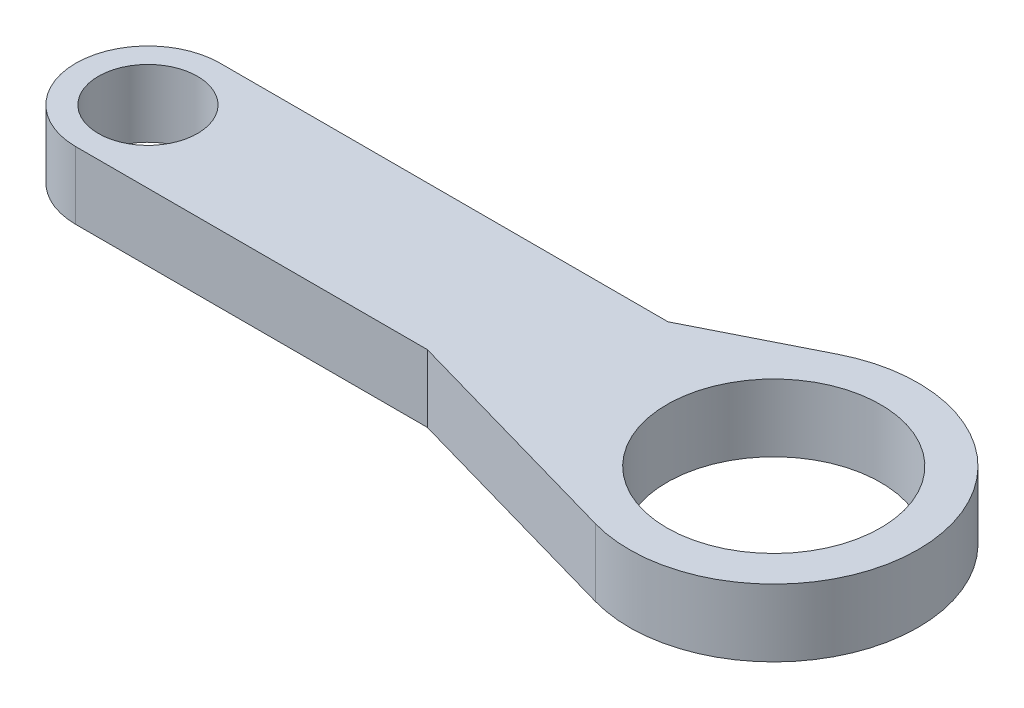
ISO-10303-21;
HEADER;
FILE_DESCRIPTION(('STEP AP214'),'2;1');
FILE_NAME('part.step','',(''),(''),'','','');
FILE_SCHEMA(('AUTOMOTIVE_DESIGN { 1 0 10303 214 1 1 1 1 }'));
ENDSEC;
DATA;
#1=APPLICATION_CONTEXT('core data for automotive mechanical design processes');
#2=APPLICATION_PROTOCOL_DEFINITION('international standard','automotive_design',2000,#1);
#3=PRODUCT_CONTEXT('',#1,'mechanical');
#4=PRODUCT('Part','Part','',(#3));
#5=PRODUCT_RELATED_PRODUCT_CATEGORY('part','',(#4));
#6=PRODUCT_DEFINITION_FORMATION('','',#4);
#7=PRODUCT_DEFINITION_CONTEXT('part definition',#1,'design');
#8=PRODUCT_DEFINITION('design','',#6,#7);
#9=PRODUCT_DEFINITION_SHAPE('','',#8);
#10=(LENGTH_UNIT() NAMED_UNIT(*) SI_UNIT(.MILLI.,.METRE.));
#11=(NAMED_UNIT(*) PLANE_ANGLE_UNIT() SI_UNIT($,.RADIAN.));
#12=(NAMED_UNIT(*) SI_UNIT($,.STERADIAN.) SOLID_ANGLE_UNIT());
#13=UNCERTAINTY_MEASURE_WITH_UNIT(LENGTH_MEASURE(1.E-05),#10,'distance_accuracy_value','');
#14=(GEOMETRIC_REPRESENTATION_CONTEXT(3) GLOBAL_UNCERTAINTY_ASSIGNED_CONTEXT((#13)) GLOBAL_UNIT_ASSIGNED_CONTEXT((#10,
#11,#12)) REPRESENTATION_CONTEXT('',''));
#15=CARTESIAN_POINT('',(0.,0.,0.));
#16=DIRECTION('',(0.,0.,1.));
#17=DIRECTION('',(1.,0.,0.));
#18=AXIS2_PLACEMENT_3D('',#15,#16,#17);
#19=CARTESIAN_POINT('',(0.,3.5,0.));
#20=DIRECTION('',(0.,-1.,0.));
#21=DIRECTION('',(0.,0.,-1.));
#22=AXIS2_PLACEMENT_3D('',#19,#20,#21);
#23=CYLINDRICAL_SURFACE('',#22,15.);
#24=CARTESIAN_POINT('',(0.,-3.5,0.));
#25=DIRECTION('',(0.,1.,0.));
#26=DIRECTION('',(0.,0.,1.));
#27=AXIS2_PLACEMENT_3D('',#24,#25,#26);
#28=CIRCLE('',#27,15.);
#29=CARTESIAN_POINT('',(-4.09994557785104,-3.5,14.4288061272809));
#30=VERTEX_POINT('',#29);
#31=CARTESIAN_POINT('',(-6.73405703707536,-3.5,-13.4034501461906));
#32=VERTEX_POINT('',#31);
#33=EDGE_CURVE('E137',#30,#32,#28,.T.);
#34=ORIENTED_EDGE('',*,*,#33,.T.);
#35=DIRECTION('',(0.,-1.,0.));
#36=VECTOR('',#35,1.);
#37=CARTESIAN_POINT('',(-6.73405703707536,3.5,-13.4034501461906));
#38=LINE('',#37,#36);
#39=CARTESIAN_POINT('',(-6.73405703707536,3.5,-13.4034501461906));
#40=VERTEX_POINT('',#39);
#41=EDGE_CURVE('E11',#40,#32,#38,.T.);
#42=ORIENTED_EDGE('',*,*,#41,.F.);
#43=CARTESIAN_POINT('',(0.,3.5,0.));
#44=DIRECTION('',(0.,1.,0.));
#45=DIRECTION('',(0.,0.,1.));
#46=AXIS2_PLACEMENT_3D('',#43,#44,#45);
#47=CIRCLE('',#46,15.);
#48=CARTESIAN_POINT('',(-4.09994557785104,3.5,14.4288061272809));
#49=VERTEX_POINT('',#48);
#50=EDGE_CURVE('E92',#49,#40,#47,.T.);
#51=ORIENTED_EDGE('',*,*,#50,.F.);
#52=DIRECTION('',(0.,-1.,0.));
#53=VECTOR('',#52,1.);
#54=CARTESIAN_POINT('',(-4.09994557785104,3.5,14.4288061272809));
#55=LINE('',#54,#53);
#56=EDGE_CURVE('E136',#49,#30,#55,.T.);
#57=ORIENTED_EDGE('',*,*,#56,.T.);
#58=EDGE_LOOP('',(#34,#42,#51,#57));
#59=FACE_BOUND('',#58,.T.);
#60=ADVANCED_FACE('F41',(#59),#23,.T.);
#61=CARTESIAN_POINT('',(-6.73405703707536,3.5,-13.4034501461906));
#62=DIRECTION('',(-0.448937135805024,0.,-0.893563343079371));
#63=DIRECTION('',(-0.893563343079371,0.,0.448937135805024));
#64=AXIS2_PLACEMENT_3D('',#61,#62,#63);
#65=PLANE('',#64);
#66=DIRECTION('',(0.893563343079371,0.,-0.448937135805024));
#67=VECTOR('',#66,1.);
#68=CARTESIAN_POINT('',(-6.73405703707536,-3.5,-13.4034501461906));
#69=LINE('',#68,#67);
#70=CARTESIAN_POINT('',(-18.4842693220832,-3.5,-7.5));
#71=VERTEX_POINT('',#70);
#72=EDGE_CURVE('E141',#71,#32,#69,.T.);
#73=ORIENTED_EDGE('',*,*,#72,.F.);
#74=DIRECTION('',(0.,-1.,0.));
#75=VECTOR('',#74,1.);
#76=CARTESIAN_POINT('',(-18.4842693220832,3.5,-7.5));
#77=LINE('',#76,#75);
#78=CARTESIAN_POINT('',(-18.4842693220832,3.5,-7.5));
#79=VERTEX_POINT('',#78);
#80=EDGE_CURVE('E50',#79,#71,#77,.T.);
#81=ORIENTED_EDGE('',*,*,#80,.F.);
#82=DIRECTION('',(0.893563343079371,0.,-0.448937135805024));
#83=VECTOR('',#82,1.);
#84=CARTESIAN_POINT('',(-6.73405703707536,3.5,-13.4034501461906));
#85=LINE('',#84,#83);
#86=EDGE_CURVE('E291',#79,#40,#85,.T.);
#87=ORIENTED_EDGE('',*,*,#86,.T.);
#88=ORIENTED_EDGE('',*,*,#41,.T.);
#89=EDGE_LOOP('',(#73,#81,#87,#88));
#90=FACE_BOUND('',#89,.T.);
#91=ADVANCED_FACE('F175',(#90),#65,.T.);
#92=CARTESIAN_POINT('',(0.,3.5,-7.5));
#93=DIRECTION('',(0.,0.,-1.));
#94=DIRECTION('',(-1.,0.,0.));
#95=AXIS2_PLACEMENT_3D('',#92,#93,#94);
#96=PLANE('',#95);
#97=DIRECTION('',(1.,0.,0.));
#98=VECTOR('',#97,1.);
#99=CARTESIAN_POINT('',(0.,-3.5,-7.5));
#100=LINE('',#99,#98);
#101=CARTESIAN_POINT('',(-65.,-3.5,-7.5));
#102=VERTEX_POINT('',#101);
#103=EDGE_CURVE('E145',#102,#71,#100,.T.);
#104=ORIENTED_EDGE('',*,*,#103,.F.);
#105=DIRECTION('',(0.,-1.,0.));
#106=VECTOR('',#105,1.);
#107=CARTESIAN_POINT('',(-65.,3.5,-7.5));
#108=LINE('',#107,#106);
#109=CARTESIAN_POINT('',(-65.,3.5,-7.5));
#110=VERTEX_POINT('',#109);
#111=EDGE_CURVE('E118',#110,#102,#108,.T.);
#112=ORIENTED_EDGE('',*,*,#111,.F.);
#113=DIRECTION('',(1.,0.,0.));
#114=VECTOR('',#113,1.);
#115=CARTESIAN_POINT('',(0.,3.5,-7.5));
#116=LINE('',#115,#114);
#117=EDGE_CURVE('E109',#110,#79,#116,.T.);
#118=ORIENTED_EDGE('',*,*,#117,.T.);
#119=ORIENTED_EDGE('',*,*,#80,.T.);
#120=EDGE_LOOP('',(#104,#112,#118,#119));
#121=FACE_BOUND('',#120,.T.);
#122=ADVANCED_FACE('F172',(#121),#96,.T.);
#123=CARTESIAN_POINT('',(-65.,3.5,0.));
#124=DIRECTION('',(0.,-1.,0.));
#125=DIRECTION('',(0.,0.,-1.));
#126=AXIS2_PLACEMENT_3D('',#123,#124,#125);
#127=CYLINDRICAL_SURFACE('',#126,7.5);
#128=CARTESIAN_POINT('',(-65.,-3.5,0.));
#129=DIRECTION('',(0.,1.,0.));
#130=DIRECTION('',(0.,0.,1.));
#131=AXIS2_PLACEMENT_3D('',#128,#129,#130);
#132=CIRCLE('',#131,7.5);
#133=CARTESIAN_POINT('',(-65.,-3.5,7.5));
#134=VERTEX_POINT('',#133);
#135=EDGE_CURVE('E116',#102,#134,#132,.T.);
#136=ORIENTED_EDGE('',*,*,#135,.T.);
#137=DIRECTION('',(0.,-1.,0.));
#138=VECTOR('',#137,1.);
#139=CARTESIAN_POINT('',(-65.,3.5,7.5));
#140=LINE('',#139,#138);
#141=CARTESIAN_POINT('',(-65.,3.5,7.5));
#142=VERTEX_POINT('',#141);
#143=EDGE_CURVE('E113',#142,#134,#140,.T.);
#144=ORIENTED_EDGE('',*,*,#143,.F.);
#145=CARTESIAN_POINT('',(-65.,3.5,0.));
#146=DIRECTION('',(0.,1.,0.));
#147=DIRECTION('',(0.,0.,1.));
#148=AXIS2_PLACEMENT_3D('',#145,#146,#147);
#149=CIRCLE('',#148,7.5);
#150=EDGE_CURVE('E102',#110,#142,#149,.T.);
#151=ORIENTED_EDGE('',*,*,#150,.F.);
#152=ORIENTED_EDGE('',*,*,#111,.T.);
#153=EDGE_LOOP('',(#136,#144,#151,#152));
#154=FACE_BOUND('',#153,.T.);
#155=ADVANCED_FACE('F114',(#154),#127,.T.);
#156=CARTESIAN_POINT('',(0.,3.5,7.5));
#157=DIRECTION('',(0.,0.,-1.));
#158=DIRECTION('',(-1.,0.,0.));
#159=AXIS2_PLACEMENT_3D('',#156,#157,#158);
#160=PLANE('',#159);
#161=DIRECTION('',(1.,0.,0.));
#162=VECTOR('',#161,1.);
#163=CARTESIAN_POINT('',(0.,-3.5,7.5));
#164=LINE('',#163,#162);
#165=CARTESIAN_POINT('',(-28.4842693220832,-3.5,7.5));
#166=VERTEX_POINT('',#165);
#167=EDGE_CURVE('E80',#134,#166,#164,.T.);
#168=ORIENTED_EDGE('',*,*,#167,.T.);
#169=DIRECTION('',(0.,-1.,0.));
#170=VECTOR('',#169,1.);
#171=CARTESIAN_POINT('',(-28.4842693220832,3.5,7.5));
#172=LINE('',#171,#170);
#173=CARTESIAN_POINT('',(-28.4842693220832,3.5,7.5));
#174=VERTEX_POINT('',#173);
#175=EDGE_CURVE('E119',#174,#166,#172,.T.);
#176=ORIENTED_EDGE('',*,*,#175,.F.);
#177=DIRECTION('',(1.,0.,0.));
#178=VECTOR('',#177,1.);
#179=CARTESIAN_POINT('',(0.,3.5,7.5));
#180=LINE('',#179,#178);
#181=EDGE_CURVE('E107',#142,#174,#180,.T.);
#182=ORIENTED_EDGE('',*,*,#181,.F.);
#183=ORIENTED_EDGE('',*,*,#143,.T.);
#184=EDGE_LOOP('',(#168,#176,#182,#183));
#185=FACE_BOUND('',#184,.T.);
#186=ADVANCED_FACE('F121',(#185),#160,.F.);
#187=CARTESIAN_POINT('',(-65.,3.5,0.));
#188=DIRECTION('',(0.,-1.,0.));
#189=DIRECTION('',(0.,0.,-1.));
#190=AXIS2_PLACEMENT_3D('',#187,#188,#189);
#191=CYLINDRICAL_SURFACE('',#190,5.15);
#192=CARTESIAN_POINT('',(-65.,3.5,0.));
#193=DIRECTION('',(0.,1.,0.));
#194=DIRECTION('',(0.,0.,1.));
#195=AXIS2_PLACEMENT_3D('',#192,#193,#194);
#196=CIRCLE('',#195,5.15);
#197=CARTESIAN_POINT('',(-65.,3.5,5.15));
#198=VERTEX_POINT('',#197);
#199=EDGE_CURVE('E125',#198,#198,#196,.T.);
#200=ORIENTED_EDGE('',*,*,#199,.T.);
#201=EDGE_LOOP('',(#200));
#202=FACE_BOUND('',#201,.T.);
#203=CARTESIAN_POINT('',(-65.,-3.5,0.));
#204=DIRECTION('',(0.,1.,0.));
#205=DIRECTION('',(0.,0.,1.));
#206=AXIS2_PLACEMENT_3D('',#203,#204,#205);
#207=CIRCLE('',#206,5.15);
#208=CARTESIAN_POINT('',(-65.,-3.5,5.15));
#209=VERTEX_POINT('',#208);
#210=EDGE_CURVE('E155',#209,#209,#207,.T.);
#211=ORIENTED_EDGE('',*,*,#210,.F.);
#212=EDGE_LOOP('',(#211));
#213=FACE_BOUND('',#212,.T.);
#214=ADVANCED_FACE('F184',(#202,#213),#191,.F.);
#215=CARTESIAN_POINT('',(-4.09994557785104,3.5,14.4288061272809));
#216=DIRECTION('',(0.273329705190069,0.,-0.961920408485396));
#217=DIRECTION('',(-0.961920408485396,0.,-0.273329705190069));
#218=AXIS2_PLACEMENT_3D('',#215,#216,#217);
#219=PLANE('',#218);
#220=DIRECTION('',(0.961920408485395,0.,0.273329705190069));
#221=VECTOR('',#220,1.);
#222=CARTESIAN_POINT('',(-4.09994557785104,-3.5,14.4288061272809));
#223=LINE('',#222,#221);
#224=EDGE_CURVE('E86',#166,#30,#223,.T.);
#225=ORIENTED_EDGE('',*,*,#224,.T.);
#226=ORIENTED_EDGE('',*,*,#56,.F.);
#227=DIRECTION('',(0.961920408485395,0.,0.273329705190069));
#228=VECTOR('',#227,1.);
#229=CARTESIAN_POINT('',(-4.09994557785104,3.5,14.4288061272809));
#230=LINE('',#229,#228);
#231=EDGE_CURVE('E58',#174,#49,#230,.T.);
#232=ORIENTED_EDGE('',*,*,#231,.F.);
#233=ORIENTED_EDGE('',*,*,#175,.T.);
#234=EDGE_LOOP('',(#225,#226,#232,#233));
#235=FACE_BOUND('',#234,.T.);
#236=ADVANCED_FACE('F181',(#235),#219,.F.);
#237=CARTESIAN_POINT('',(0.,3.5,0.));
#238=DIRECTION('',(0.,-1.,0.));
#239=DIRECTION('',(0.,0.,-1.));
#240=AXIS2_PLACEMENT_3D('',#237,#238,#239);
#241=CYLINDRICAL_SURFACE('',#240,11.1);
#242=CARTESIAN_POINT('',(0.,3.5,0.));
#243=DIRECTION('',(0.,1.,0.));
#244=DIRECTION('',(0.,0.,1.));
#245=AXIS2_PLACEMENT_3D('',#242,#243,#244);
#246=CIRCLE('',#245,11.1);
#247=CARTESIAN_POINT('',(0.,3.5,11.1));
#248=VERTEX_POINT('',#247);
#249=EDGE_CURVE('E132',#248,#248,#246,.T.);
#250=ORIENTED_EDGE('',*,*,#249,.T.);
#251=EDGE_LOOP('',(#250));
#252=FACE_BOUND('',#251,.T.);
#253=CARTESIAN_POINT('',(0.,-3.5,0.));
#254=DIRECTION('',(0.,1.,0.));
#255=DIRECTION('',(0.,0.,1.));
#256=AXIS2_PLACEMENT_3D('',#253,#254,#255);
#257=CIRCLE('',#256,11.1);
#258=CARTESIAN_POINT('',(0.,-3.5,11.1));
#259=VERTEX_POINT('',#258);
#260=EDGE_CURVE('E159',#259,#259,#257,.T.);
#261=ORIENTED_EDGE('',*,*,#260,.F.);
#262=EDGE_LOOP('',(#261));
#263=FACE_BOUND('',#262,.T.);
#264=ADVANCED_FACE('F183',(#252,#263),#241,.F.);
#265=CARTESIAN_POINT('',(0.,3.5,0.));
#266=DIRECTION('',(0.,1.,0.));
#267=DIRECTION('',(0.,0.,1.));
#268=AXIS2_PLACEMENT_3D('',#265,#266,#267);
#269=PLANE('',#268);
#270=ORIENTED_EDGE('',*,*,#50,.T.);
#271=ORIENTED_EDGE('',*,*,#86,.F.);
#272=ORIENTED_EDGE('',*,*,#117,.F.);
#273=ORIENTED_EDGE('',*,*,#150,.T.);
#274=ORIENTED_EDGE('',*,*,#181,.T.);
#275=ORIENTED_EDGE('',*,*,#231,.T.);
#276=EDGE_LOOP('',(#270,#271,#272,#273,#274,#275));
#277=FACE_BOUND('',#276,.T.);
#278=ORIENTED_EDGE('',*,*,#199,.F.);
#279=EDGE_LOOP('',(#278));
#280=FACE_BOUND('',#279,.T.);
#281=ORIENTED_EDGE('',*,*,#249,.F.);
#282=EDGE_LOOP('',(#281));
#283=FACE_BOUND('',#282,.T.);
#284=ADVANCED_FACE('F104',(#277,#280,#283),#269,.T.);
#285=CARTESIAN_POINT('',(0.,-3.5,0.));
#286=DIRECTION('',(0.,1.,0.));
#287=DIRECTION('',(0.,0.,1.));
#288=AXIS2_PLACEMENT_3D('',#285,#286,#287);
#289=PLANE('',#288);
#290=ORIENTED_EDGE('',*,*,#33,.F.);
#291=ORIENTED_EDGE('',*,*,#224,.F.);
#292=ORIENTED_EDGE('',*,*,#167,.F.);
#293=ORIENTED_EDGE('',*,*,#135,.F.);
#294=ORIENTED_EDGE('',*,*,#103,.T.);
#295=ORIENTED_EDGE('',*,*,#72,.T.);
#296=EDGE_LOOP('',(#290,#291,#292,#293,#294,#295));
#297=FACE_BOUND('',#296,.T.);
#298=ORIENTED_EDGE('',*,*,#210,.T.);
#299=EDGE_LOOP('',(#298));
#300=FACE_BOUND('',#299,.T.);
#301=ORIENTED_EDGE('',*,*,#260,.T.);
#302=EDGE_LOOP('',(#301));
#303=FACE_BOUND('',#302,.T.);
#304=ADVANCED_FACE('F178',(#297,#300,#303),#289,.F.);
#305=CLOSED_SHELL('',(#60,#91,#122,#155,#186,#214,#236,#264,#284,#304));
#306=MANIFOLD_SOLID_BREP('B2',#305);
#307=ADVANCED_BREP_SHAPE_REPRESENTATION('',(#18,#306),#14);
#308=SHAPE_DEFINITION_REPRESENTATION(#9,#307);
ENDSEC;
END-ISO-10303-21;
